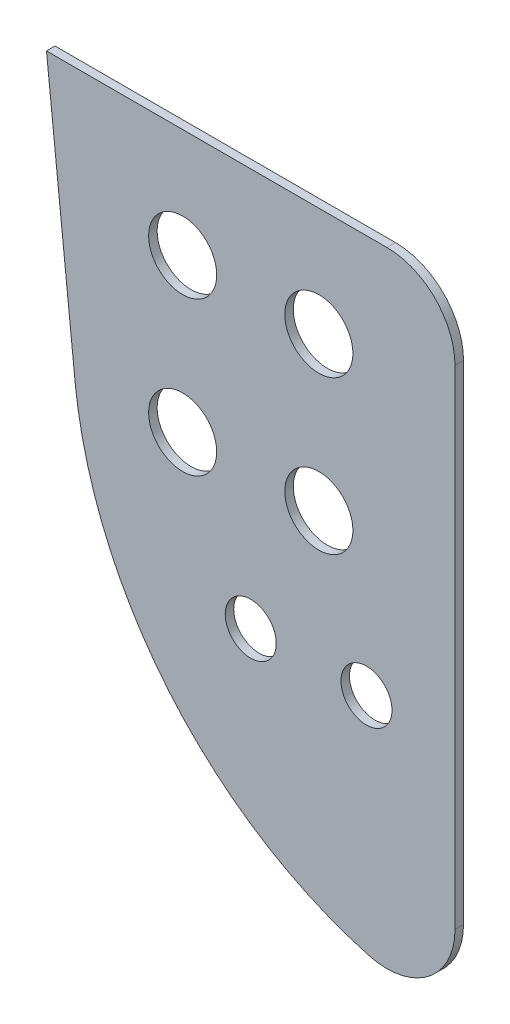
ISO-10303-21;
HEADER;
FILE_DESCRIPTION(('STEP AP214'),'2;1');
FILE_NAME('part.step','',(''),(''),'','','');
FILE_SCHEMA(('AUTOMOTIVE_DESIGN { 1 0 10303 214 1 1 1 1 }'));
ENDSEC;
DATA;
#1=APPLICATION_CONTEXT('core data for automotive mechanical design processes');
#2=APPLICATION_PROTOCOL_DEFINITION('international standard','automotive_design',2000,#1);
#3=PRODUCT_CONTEXT('',#1,'mechanical');
#4=PRODUCT('Part','Part','',(#3));
#5=PRODUCT_RELATED_PRODUCT_CATEGORY('part','',(#4));
#6=PRODUCT_DEFINITION_FORMATION('','',#4);
#7=PRODUCT_DEFINITION_CONTEXT('part definition',#1,'design');
#8=PRODUCT_DEFINITION('design','',#6,#7);
#9=PRODUCT_DEFINITION_SHAPE('','',#8);
#10=(LENGTH_UNIT() NAMED_UNIT(*) SI_UNIT(.MILLI.,.METRE.));
#11=(NAMED_UNIT(*) PLANE_ANGLE_UNIT() SI_UNIT($,.RADIAN.));
#12=(NAMED_UNIT(*) SI_UNIT($,.STERADIAN.) SOLID_ANGLE_UNIT());
#13=UNCERTAINTY_MEASURE_WITH_UNIT(LENGTH_MEASURE(1.E-05),#10,'distance_accuracy_value','');
#14=(GEOMETRIC_REPRESENTATION_CONTEXT(3) GLOBAL_UNCERTAINTY_ASSIGNED_CONTEXT((#13)) GLOBAL_UNIT_ASSIGNED_CONTEXT((#10,
#11,#12)) REPRESENTATION_CONTEXT('',''));
#15=CARTESIAN_POINT('',(0.,0.,0.));
#16=DIRECTION('',(0.,0.,1.));
#17=DIRECTION('',(1.,0.,0.));
#18=AXIS2_PLACEMENT_3D('',#15,#16,#17);
#19=CARTESIAN_POINT('',(-55.5753125764344,-162.067948142255,1.5875));
#20=CARTESIAN_POINT('',(-55.5937634202279,-162.065079619275,1.5875));
#21=CARTESIAN_POINT('',(-55.6501718933935,-162.056309884764,1.5875));
#22=CARTESIAN_POINT('',(-55.8583674100349,-162.023649385633,1.5875));
#23=CARTESIAN_POINT('',(-56.3514238039507,-161.944371510329,1.5875));
#24=CARTESIAN_POINT('',(-57.298183961833,-161.782953676702,1.5875));
#25=CARTESIAN_POINT('',(-59.6017022519586,-161.351219818293,1.5875));
#26=CARTESIAN_POINT('',(-62.636225687786,-160.651117849293,1.5875));
#27=CARTESIAN_POINT('',(-66.2582386472134,-159.610029405227,1.5875));
#28=CARTESIAN_POINT('',(-69.4663735532384,-158.528422887972,1.5875));
#29=CARTESIAN_POINT('',(-72.6936574974443,-157.269325681401,1.5875));
#30=CARTESIAN_POINT('',(-75.860283712135,-155.860035915543,1.5875));
#31=CARTESIAN_POINT('',(-78.9595045045267,-154.303585308623,1.5875));
#32=CARTESIAN_POINT('',(-81.984721099693,-152.603319471626,1.5875));
#33=CARTESIAN_POINT('',(-84.9294968822904,-150.762889624598,1.5875));
#34=CARTESIAN_POINT('',(-87.7875712408948,-148.786244312367,1.5875));
#35=CARTESIAN_POINT('',(-90.5528724272744,-146.677620257666,1.5875));
#36=CARTESIAN_POINT('',(-93.2195301655137,-144.441532811794,1.5875));
#37=CARTESIAN_POINT('',(-95.7818876467089,-142.082765830705,1.5875));
#38=CARTESIAN_POINT('',(-98.2345130698466,-139.606361101245,1.5875));
#39=CARTESIAN_POINT('',(-100.572210642775,-137.017607296888,1.5875));
#40=CARTESIAN_POINT('',(-102.790031074147,-134.322028508125,1.5875));
#41=CARTESIAN_POINT('',(-104.883281532582,-131.52537235786,1.5875));
#42=CARTESIAN_POINT('',(-106.847535073233,-128.633597726726,1.5875));
#43=CARTESIAN_POINT('',(-108.678639520184,-125.65286210404,1.5875));
#44=CARTESIAN_POINT('',(-110.372725796157,-122.589508584141,1.5875));
#45=CARTESIAN_POINT('',(-111.926215688639,-119.450052525176,1.5875));
#46=CARTESIAN_POINT('',(-113.335829040257,-116.241167889729,1.5875));
#47=CARTESIAN_POINT('',(-114.598590351131,-112.969673286444,1.5875));
#48=CARTESIAN_POINT('',(-115.711834779468,-109.64251773389,1.5875));
#49=CARTESIAN_POINT('',(-116.673213527241,-106.266766169047,1.5875));
#50=CARTESIAN_POINT('',(-117.480698597298,-102.849584724549,1.5875));
#51=CARTESIAN_POINT('',(-118.132586909511,-99.3982258005629,1.5875));
#52=CARTESIAN_POINT('',(-118.490033874139,-96.8861338876433,1.5875));
#53=CARTESIAN_POINT('',(-118.65560682663,-95.4515113050125,1.5875));
#54=CARTESIAN_POINT('',(-118.689766491121,-95.141139609897,1.5875));
#55=CARTESIAN_POINT('',(-118.706492882473,-94.9859144502731,1.5875));
#56=CARTESIAN_POINT('',(-118.715898663566,-94.8974127943878,1.5875));
#57=CARTESIAN_POINT('',(-118.721125626195,-94.8477178147802,1.5875));
#58=CARTESIAN_POINT('',(-118.722269765783,-94.8368399881106,1.5875));
#59=B_SPLINE_CURVE_WITH_KNOTS('',3,(#19,#20,#21,#22,#23,#24,#25,#26,#27,#28,#29,#30,#31,#32,#33,
#34,#35,#36,#37,#38,#39,#40,#41,#42,#43,#44,#45,#46,#47,#48,#49,#50,#51,#52,#53,#54,#55,#56,#57,
#58),.UNSPECIFIED.,.F.,.F.,(4,1,1,1,1,1,1,1,1,1,1,1,1,1,1,1,1,1,1,1,1,1,1,1,1,1,1,1,1,1,1,1,1,1,
1,1,1,4),(0.,0.000570633598854887,0.00174455815726286,0.00644023217890964,0.0158314421469477,
0.0310917362595948,0.0780426670362767,0.110904268378024,0.14610878501369,0.181308268021674,
0.216502218694187,0.251690199044534,0.286871835073815,0.322046819021149,0.357214910625814,
0.392375937451426,0.427529794346761,0.462676442118867,0.497815905524348,0.532948270670172,
0.568073681942947,0.603192338554142,0.638304490817737,0.673410436233072,0.708510515478586,
0.743605108360691,0.778694629810304,0.813779525947191,0.848860270265249,0.883937359958274,
0.919011312394996,0.954082661750745,0.989151955792768,0.994996677383629,0.997334554956801,
0.998503491454653,0.999672426456465,1.),.UNSPECIFIED.);
#60=DIRECTION('',(0.,0.,-1.));
#61=VECTOR('',#60,1.);
#62=SURFACE_OF_LINEAR_EXTRUSION('',#59,#61);
#63=CARTESIAN_POINT('',(-55.5753125764344,-162.067948142255,0.));
#64=CARTESIAN_POINT('',(-55.5937634202279,-162.065079619275,0.));
#65=CARTESIAN_POINT('',(-55.6501718933935,-162.056309884764,0.));
#66=CARTESIAN_POINT('',(-55.8583674100349,-162.023649385633,0.));
#67=CARTESIAN_POINT('',(-56.3514238039507,-161.944371510329,0.));
#68=CARTESIAN_POINT('',(-57.298183961833,-161.782953676702,0.));
#69=CARTESIAN_POINT('',(-59.6017022519586,-161.351219818293,0.));
#70=CARTESIAN_POINT('',(-62.636225687786,-160.651117849293,0.));
#71=CARTESIAN_POINT('',(-66.2582386472134,-159.610029405227,0.));
#72=CARTESIAN_POINT('',(-69.4663735532384,-158.528422887972,0.));
#73=CARTESIAN_POINT('',(-72.6936574974443,-157.269325681401,0.));
#74=CARTESIAN_POINT('',(-75.860283712135,-155.860035915543,0.));
#75=CARTESIAN_POINT('',(-78.9595045045267,-154.303585308623,0.));
#76=CARTESIAN_POINT('',(-81.984721099693,-152.603319471626,0.));
#77=CARTESIAN_POINT('',(-84.9294968822904,-150.762889624598,0.));
#78=CARTESIAN_POINT('',(-87.7875712408948,-148.786244312367,0.));
#79=CARTESIAN_POINT('',(-90.5528724272744,-146.677620257666,0.));
#80=CARTESIAN_POINT('',(-93.2195301655137,-144.441532811794,0.));
#81=CARTESIAN_POINT('',(-95.7818876467089,-142.082765830705,0.));
#82=CARTESIAN_POINT('',(-98.2345130698466,-139.606361101245,0.));
#83=CARTESIAN_POINT('',(-100.572210642775,-137.017607296888,0.));
#84=CARTESIAN_POINT('',(-102.790031074147,-134.322028508125,0.));
#85=CARTESIAN_POINT('',(-104.883281532582,-131.52537235786,0.));
#86=CARTESIAN_POINT('',(-106.847535073233,-128.633597726726,0.));
#87=CARTESIAN_POINT('',(-108.678639520184,-125.65286210404,0.));
#88=CARTESIAN_POINT('',(-110.372725796157,-122.589508584141,0.));
#89=CARTESIAN_POINT('',(-111.926215688639,-119.450052525176,0.));
#90=CARTESIAN_POINT('',(-113.335829040257,-116.241167889729,0.));
#91=CARTESIAN_POINT('',(-114.598590351131,-112.969673286444,0.));
#92=CARTESIAN_POINT('',(-115.711834779468,-109.64251773389,0.));
#93=CARTESIAN_POINT('',(-116.673213527241,-106.266766169047,0.));
#94=CARTESIAN_POINT('',(-117.480698597298,-102.849584724549,0.));
#95=CARTESIAN_POINT('',(-118.132586909511,-99.3982258005629,0.));
#96=CARTESIAN_POINT('',(-118.490033874139,-96.8861338876433,0.));
#97=CARTESIAN_POINT('',(-118.65560682663,-95.4515113050125,0.));
#98=CARTESIAN_POINT('',(-118.689766491121,-95.141139609897,0.));
#99=CARTESIAN_POINT('',(-118.706492882473,-94.9859144502731,0.));
#100=CARTESIAN_POINT('',(-118.715898663566,-94.8974127943878,0.));
#101=CARTESIAN_POINT('',(-118.721125626195,-94.8477178147802,0.));
#102=CARTESIAN_POINT('',(-118.722269765783,-94.8368399881106,0.));
#103=B_SPLINE_CURVE_WITH_KNOTS('',3,(#63,#64,#65,#66,#67,#68,#69,#70,#71,#72,#73,#74,#75,#76,
#77,#78,#79,#80,#81,#82,#83,#84,#85,#86,#87,#88,#89,#90,#91,#92,#93,#94,#95,#96,#97,#98,#99,
#100,#101,#102),.UNSPECIFIED.,.F.,.F.,(4,1,1,1,1,1,1,1,1,1,1,1,1,1,1,1,1,1,1,1,1,1,1,1,1,1,1,1,
1,1,1,1,1,1,1,1,1,4),(0.,0.000570633598854887,0.00174455815726286,0.00644023217890964,
0.0158314421469477,0.0310917362595948,0.0780426670362767,0.110904268378024,0.14610878501369,
0.181308268021674,0.216502218694187,0.251690199044534,0.286871835073815,0.322046819021149,
0.357214910625814,0.392375937451426,0.427529794346761,0.462676442118867,0.497815905524348,
0.532948270670172,0.568073681942947,0.603192338554142,0.638304490817737,0.673410436233072,
0.708510515478586,0.743605108360691,0.778694629810304,0.813779525947191,0.848860270265249,
0.883937359958274,0.919011312394996,0.954082661750745,0.989151955792768,0.994996677383629,
0.997334554956801,0.998503491454653,0.999672426456465,1.),.UNSPECIFIED.);
#104=CARTESIAN_POINT('',(-63.9271253798359,-160.270180817145,0.));
#105=VERTEX_POINT('',#104);
#106=CARTESIAN_POINT('',(-118.722269765783,-94.8368399881106,0.));
#107=VERTEX_POINT('',#106);
#108=EDGE_CURVE('E121',#105,#107,#103,.T.);
#109=ORIENTED_EDGE('',*,*,#108,.F.);
#110=DIRECTION('',(0.,0.,-1.));
#111=VECTOR('',#110,1.);
#112=CARTESIAN_POINT('',(-63.9271253798359,-160.270180817145,0.));
#113=LINE('',#112,#111);
#114=CARTESIAN_POINT('',(-63.9271253798359,-160.270180817145,1.5875));
#115=VERTEX_POINT('',#114);
#116=EDGE_CURVE('E63',#105,#115,#113,.F.);
#117=ORIENTED_EDGE('',*,*,#116,.T.);
#118=CARTESIAN_POINT('',(-118.722269765783,-94.8368399881106,1.5875));
#119=VERTEX_POINT('',#118);
#120=EDGE_CURVE('E134',#115,#119,#59,.T.);
#121=ORIENTED_EDGE('',*,*,#120,.T.);
#122=DIRECTION('',(0.,0.,-1.));
#123=VECTOR('',#122,1.);
#124=CARTESIAN_POINT('',(-118.722269765783,-94.8368399881106,1.5875));
#125=LINE('',#124,#123);
#126=EDGE_CURVE('E106',#119,#107,#125,.T.);
#127=ORIENTED_EDGE('',*,*,#126,.T.);
#128=EDGE_LOOP('',(#109,#117,#121,#127));
#129=FACE_BOUND('',#128,.T.);
#130=ADVANCED_FACE('F40',(#129),#62,.T.);
#131=CARTESIAN_POINT('',(-47.8397885828951,0.,1.5875));
#132=DIRECTION('',(-1.,0.,0.));
#133=DIRECTION('',(0.,-1.,0.));
#134=AXIS2_PLACEMENT_3D('',#131,#132,#133);
#135=PLANE('',#134);
#136=DIRECTION('',(0.,1.,0.));
#137=VECTOR('',#136,1.);
#138=CARTESIAN_POINT('',(-47.8397885828951,0.,1.5875));
#139=LINE('',#138,#137);
#140=CARTESIAN_POINT('',(-47.8397885828951,-148.030248242818,1.5875));
#141=VERTEX_POINT('',#140);
#142=CARTESIAN_POINT('',(-47.8397885828951,-56.9164496537827,1.5875));
#143=VERTEX_POINT('',#142);
#144=EDGE_CURVE('E111',#141,#143,#139,.T.);
#145=ORIENTED_EDGE('',*,*,#144,.F.);
#146=DIRECTION('',(0.,0.,1.));
#147=VECTOR('',#146,1.);
#148=CARTESIAN_POINT('',(-47.8397885828951,-148.030248242818,0.));
#149=LINE('',#148,#147);
#150=CARTESIAN_POINT('',(-47.8397885828951,-148.030248242818,0.));
#151=VERTEX_POINT('',#150);
#152=EDGE_CURVE('E137',#141,#151,#149,.F.);
#153=ORIENTED_EDGE('',*,*,#152,.T.);
#154=DIRECTION('',(0.,1.,0.));
#155=VECTOR('',#154,1.);
#156=CARTESIAN_POINT('',(-47.8397885828951,0.,0.));
#157=LINE('',#156,#155);
#158=CARTESIAN_POINT('',(-47.8397885828951,-56.9164496537827,0.));
#159=VERTEX_POINT('',#158);
#160=EDGE_CURVE('E125',#151,#159,#157,.T.);
#161=ORIENTED_EDGE('',*,*,#160,.T.);
#162=DIRECTION('',(0.,0.,-1.));
#163=VECTOR('',#162,1.);
#164=CARTESIAN_POINT('',(-47.8397885828951,-56.9164496537827,1.5875));
#165=LINE('',#164,#163);
#166=EDGE_CURVE('E105',#159,#143,#165,.F.);
#167=ORIENTED_EDGE('',*,*,#166,.T.);
#168=EDGE_LOOP('',(#145,#153,#161,#167));
#169=FACE_BOUND('',#168,.T.);
#170=ADVANCED_FACE('F231',(#169),#135,.F.);
#171=CARTESIAN_POINT('',(0.,-44.2164496537827,1.5875));
#172=DIRECTION('',(0.,1.,0.));
#173=DIRECTION('',(-1.,0.,0.));
#174=AXIS2_PLACEMENT_3D('',#171,#172,#173);
#175=PLANE('',#174);
#176=DIRECTION('',(1.,0.,0.));
#177=VECTOR('',#176,1.);
#178=CARTESIAN_POINT('',(0.,-44.2164496537827,1.5875));
#179=LINE('',#178,#177);
#180=CARTESIAN_POINT('',(-124.039788582895,-44.2164496537827,1.5875));
#181=VERTEX_POINT('',#180);
#182=CARTESIAN_POINT('',(-60.5397885828951,-44.2164496537827,1.5875));
#183=VERTEX_POINT('',#182);
#184=EDGE_CURVE('E97',#181,#183,#179,.T.);
#185=ORIENTED_EDGE('',*,*,#184,.T.);
#186=DIRECTION('',(0.,0.,-1.));
#187=VECTOR('',#186,1.);
#188=CARTESIAN_POINT('',(-60.5397885828951,-44.2164496537827,0.));
#189=LINE('',#188,#187);
#190=CARTESIAN_POINT('',(-60.5397885828951,-44.2164496537827,0.));
#191=VERTEX_POINT('',#190);
#192=EDGE_CURVE('E12',#183,#191,#189,.T.);
#193=ORIENTED_EDGE('',*,*,#192,.T.);
#194=DIRECTION('',(1.,0.,0.));
#195=VECTOR('',#194,1.);
#196=CARTESIAN_POINT('',(0.,-44.2164496537827,0.));
#197=LINE('',#196,#195);
#198=CARTESIAN_POINT('',(-124.039788582895,-44.2164496537827,0.));
#199=VERTEX_POINT('',#198);
#200=EDGE_CURVE('E100',#199,#191,#197,.T.);
#201=ORIENTED_EDGE('',*,*,#200,.F.);
#202=DIRECTION('',(0.,0.,-1.));
#203=VECTOR('',#202,1.);
#204=CARTESIAN_POINT('',(-124.039788582895,-44.2164496537827,1.5875));
#205=LINE('',#204,#203);
#206=EDGE_CURVE('E95',#181,#199,#205,.T.);
#207=ORIENTED_EDGE('',*,*,#206,.F.);
#208=EDGE_LOOP('',(#185,#193,#201,#207));
#209=FACE_BOUND('',#208,.T.);
#210=ADVANCED_FACE('F96',(#209),#175,.T.);
#211=CARTESIAN_POINT('',(-127.280074158691,-13.3703866151999,1.5875));
#212=DIRECTION('',(-0.994527813863391,-0.104472137204636,0.));
#213=DIRECTION('',(0.104472137204636,-0.994527813863391,0.));
#214=AXIS2_PLACEMENT_3D('',#211,#212,#213);
#215=PLANE('',#214);
#216=DIRECTION('',(-0.104472137204636,0.994527813863391,0.));
#217=VECTOR('',#216,1.);
#218=CARTESIAN_POINT('',(-127.280074158691,-13.3703866151999,0.));
#219=LINE('',#218,#217);
#220=EDGE_CURVE('E133',#107,#199,#219,.T.);
#221=ORIENTED_EDGE('',*,*,#220,.F.);
#222=ORIENTED_EDGE('',*,*,#126,.F.);
#223=DIRECTION('',(-0.104472137204636,0.994527813863391,0.));
#224=VECTOR('',#223,1.);
#225=CARTESIAN_POINT('',(-127.280074158691,-13.3703866151999,1.5875));
#226=LINE('',#225,#224);
#227=EDGE_CURVE('E110',#119,#181,#226,.T.);
#228=ORIENTED_EDGE('',*,*,#227,.T.);
#229=ORIENTED_EDGE('',*,*,#206,.T.);
#230=EDGE_LOOP('',(#221,#222,#228,#229));
#231=FACE_BOUND('',#230,.T.);
#232=ADVANCED_FACE('F114',(#231),#215,.T.);
#233=CARTESIAN_POINT('',(0.,0.,1.5875));
#234=DIRECTION('',(0.,0.,1.));
#235=DIRECTION('',(1.,0.,0.));
#236=AXIS2_PLACEMENT_3D('',#233,#234,#235);
#237=PLANE('',#236);
#238=CARTESIAN_POINT('',(-85.9397885828951,-118.511449653783,1.5875));
#239=DIRECTION('',(0.,0.,-1.));
#240=DIRECTION('',(-1.,0.,0.));
#241=AXIS2_PLACEMENT_3D('',#238,#239,#240);
#242=CIRCLE('',#241,4.7625);
#243=CARTESIAN_POINT('',(-90.7022885828951,-118.511449653783,1.5875));
#244=VERTEX_POINT('',#243);
#245=EDGE_CURVE('E199',#244,#244,#242,.T.);
#246=ORIENTED_EDGE('',*,*,#245,.T.);
#247=EDGE_LOOP('',(#246));
#248=FACE_BOUND('',#247,.T.);
#249=CARTESIAN_POINT('',(-73.2397885828951,-93.1114496537827,1.5875));
#250=DIRECTION('',(0.,0.,-1.));
#251=DIRECTION('',(-1.,0.,0.));
#252=AXIS2_PLACEMENT_3D('',#249,#250,#251);
#253=CIRCLE('',#252,6.34999999999999);
#254=CARTESIAN_POINT('',(-79.5897885828951,-93.1114496537827,1.5875));
#255=VERTEX_POINT('',#254);
#256=EDGE_CURVE('E192',#255,#255,#253,.T.);
#257=ORIENTED_EDGE('',*,*,#256,.T.);
#258=EDGE_LOOP('',(#257));
#259=FACE_BOUND('',#258,.T.);
#260=CARTESIAN_POINT('',(-98.6397885828951,-93.1114496537827,1.5875));
#261=DIRECTION('',(0.,0.,-1.));
#262=DIRECTION('',(-1.,0.,0.));
#263=AXIS2_PLACEMENT_3D('',#260,#261,#262);
#264=CIRCLE('',#263,6.34999999999999);
#265=CARTESIAN_POINT('',(-104.989788582895,-93.1114496537827,1.5875));
#266=VERTEX_POINT('',#265);
#267=EDGE_CURVE('E186',#266,#266,#264,.T.);
#268=ORIENTED_EDGE('',*,*,#267,.T.);
#269=EDGE_LOOP('',(#268));
#270=FACE_BOUND('',#269,.T.);
#271=CARTESIAN_POINT('',(-98.6397885828951,-64.5364496537827,1.5875));
#272=DIRECTION('',(0.,0.,-1.));
#273=DIRECTION('',(-1.,0.,0.));
#274=AXIS2_PLACEMENT_3D('',#271,#272,#273);
#275=CIRCLE('',#274,6.34999999999999);
#276=CARTESIAN_POINT('',(-104.989788582895,-64.5364496537827,1.5875));
#277=VERTEX_POINT('',#276);
#278=EDGE_CURVE('E175',#277,#277,#275,.T.);
#279=ORIENTED_EDGE('',*,*,#278,.T.);
#280=EDGE_LOOP('',(#279));
#281=FACE_BOUND('',#280,.T.);
#282=CARTESIAN_POINT('',(-73.2397885828951,-64.5364496537827,1.5875));
#283=DIRECTION('',(0.,0.,-1.));
#284=DIRECTION('',(-1.,0.,0.));
#285=AXIS2_PLACEMENT_3D('',#282,#283,#284);
#286=CIRCLE('',#285,6.34999999999999);
#287=CARTESIAN_POINT('',(-79.5897885828951,-64.5364496537827,1.5875));
#288=VERTEX_POINT('',#287);
#289=EDGE_CURVE('E176',#288,#288,#286,.T.);
#290=ORIENTED_EDGE('',*,*,#289,.T.);
#291=EDGE_LOOP('',(#290));
#292=FACE_BOUND('',#291,.T.);
#293=CARTESIAN_POINT('',(-64.3497885828951,-118.511449653783,1.5875));
#294=DIRECTION('',(0.,0.,-1.));
#295=DIRECTION('',(-1.,0.,0.));
#296=AXIS2_PLACEMENT_3D('',#293,#294,#295);
#297=CIRCLE('',#296,4.7625);
#298=CARTESIAN_POINT('',(-69.1122885828951,-118.511449653783,1.5875));
#299=VERTEX_POINT('',#298);
#300=EDGE_CURVE('E126',#299,#299,#297,.T.);
#301=ORIENTED_EDGE('',*,*,#300,.T.);
#302=EDGE_LOOP('',(#301));
#303=FACE_BOUND('',#302,.T.);
#304=ORIENTED_EDGE('',*,*,#120,.F.);
#305=CARTESIAN_POINT('',(-60.5397885828941,-148.030248242818,1.5875));
#306=DIRECTION('',(0.,0.,1.));
#307=DIRECTION('',(1.,0.,0.));
#308=AXIS2_PLACEMENT_3D('',#305,#306,#307);
#309=CIRCLE('',#308,12.7);
#310=EDGE_CURVE('E48',#115,#141,#309,.T.);
#311=ORIENTED_EDGE('',*,*,#310,.T.);
#312=ORIENTED_EDGE('',*,*,#144,.T.);
#313=CARTESIAN_POINT('',(-60.5397885828951,-56.9164496537827,1.5875));
#314=DIRECTION('',(0.,0.,1.));
#315=DIRECTION('',(1.,0.,0.));
#316=AXIS2_PLACEMENT_3D('',#313,#314,#315);
#317=CIRCLE('',#316,12.7);
#318=EDGE_CURVE('E55',#143,#183,#317,.T.);
#319=ORIENTED_EDGE('',*,*,#318,.T.);
#320=ORIENTED_EDGE('',*,*,#184,.F.);
#321=ORIENTED_EDGE('',*,*,#227,.F.);
#322=EDGE_LOOP('',(#304,#311,#312,#319,#320,#321));
#323=FACE_BOUND('',#322,.T.);
#324=ADVANCED_FACE('F109',(#248,#259,#270,#281,#292,#303,#323),#237,.T.);
#325=CARTESIAN_POINT('',(0.,0.,0.));
#326=DIRECTION('',(0.,0.,1.));
#327=DIRECTION('',(1.,0.,0.));
#328=AXIS2_PLACEMENT_3D('',#325,#326,#327);
#329=PLANE('',#328);
#330=CARTESIAN_POINT('',(-85.9397885828951,-118.511449653783,0.));
#331=DIRECTION('',(0.,0.,-1.));
#332=DIRECTION('',(-1.,0.,0.));
#333=AXIS2_PLACEMENT_3D('',#330,#331,#332);
#334=CIRCLE('',#333,4.7625);
#335=CARTESIAN_POINT('',(-90.7022885828951,-118.511449653783,0.));
#336=VERTEX_POINT('',#335);
#337=EDGE_CURVE('E196',#336,#336,#334,.T.);
#338=ORIENTED_EDGE('',*,*,#337,.F.);
#339=EDGE_LOOP('',(#338));
#340=FACE_BOUND('',#339,.T.);
#341=CARTESIAN_POINT('',(-73.2397885828951,-93.1114496537827,0.));
#342=DIRECTION('',(0.,0.,-1.));
#343=DIRECTION('',(-1.,0.,0.));
#344=AXIS2_PLACEMENT_3D('',#341,#342,#343);
#345=CIRCLE('',#344,6.34999999999999);
#346=CARTESIAN_POINT('',(-79.5897885828951,-93.1114496537827,0.));
#347=VERTEX_POINT('',#346);
#348=EDGE_CURVE('E190',#347,#347,#345,.T.);
#349=ORIENTED_EDGE('',*,*,#348,.F.);
#350=EDGE_LOOP('',(#349));
#351=FACE_BOUND('',#350,.T.);
#352=CARTESIAN_POINT('',(-98.6397885828951,-93.1114496537827,0.));
#353=DIRECTION('',(0.,0.,-1.));
#354=DIRECTION('',(-1.,0.,0.));
#355=AXIS2_PLACEMENT_3D('',#352,#353,#354);
#356=CIRCLE('',#355,6.34999999999999);
#357=CARTESIAN_POINT('',(-104.989788582895,-93.1114496537827,0.));
#358=VERTEX_POINT('',#357);
#359=EDGE_CURVE('E180',#358,#358,#356,.T.);
#360=ORIENTED_EDGE('',*,*,#359,.F.);
#361=EDGE_LOOP('',(#360));
#362=FACE_BOUND('',#361,.T.);
#363=CARTESIAN_POINT('',(-98.6397885828951,-64.5364496537827,0.));
#364=DIRECTION('',(0.,0.,-1.));
#365=DIRECTION('',(-1.,0.,0.));
#366=AXIS2_PLACEMENT_3D('',#363,#364,#365);
#367=CIRCLE('',#366,6.34999999999999);
#368=CARTESIAN_POINT('',(-104.989788582895,-64.5364496537827,0.));
#369=VERTEX_POINT('',#368);
#370=EDGE_CURVE('E172',#369,#369,#367,.T.);
#371=ORIENTED_EDGE('',*,*,#370,.F.);
#372=EDGE_LOOP('',(#371));
#373=FACE_BOUND('',#372,.T.);
#374=CARTESIAN_POINT('',(-73.2397885828951,-64.5364496537827,0.));
#375=DIRECTION('',(0.,0.,-1.));
#376=DIRECTION('',(-1.,0.,0.));
#377=AXIS2_PLACEMENT_3D('',#374,#375,#376);
#378=CIRCLE('',#377,6.34999999999999);
#379=CARTESIAN_POINT('',(-79.5897885828951,-64.5364496537827,0.));
#380=VERTEX_POINT('',#379);
#381=EDGE_CURVE('E203',#380,#380,#378,.T.);
#382=ORIENTED_EDGE('',*,*,#381,.F.);
#383=EDGE_LOOP('',(#382));
#384=FACE_BOUND('',#383,.T.);
#385=CARTESIAN_POINT('',(-64.3497885828951,-118.511449653783,0.));
#386=DIRECTION('',(0.,0.,-1.));
#387=DIRECTION('',(-1.,0.,0.));
#388=AXIS2_PLACEMENT_3D('',#385,#386,#387);
#389=CIRCLE('',#388,4.7625);
#390=CARTESIAN_POINT('',(-69.1122885828951,-118.511449653783,0.));
#391=VERTEX_POINT('',#390);
#392=EDGE_CURVE('E157',#391,#391,#389,.T.);
#393=ORIENTED_EDGE('',*,*,#392,.F.);
#394=EDGE_LOOP('',(#393));
#395=FACE_BOUND('',#394,.T.);
#396=ORIENTED_EDGE('',*,*,#160,.F.);
#397=CARTESIAN_POINT('',(-60.5397885828941,-148.030248242818,0.));
#398=DIRECTION('',(0.,0.,1.));
#399=DIRECTION('',(1.,0.,0.));
#400=AXIS2_PLACEMENT_3D('',#397,#398,#399);
#401=CIRCLE('',#400,12.7);
#402=EDGE_CURVE('E142',#151,#105,#401,.F.);
#403=ORIENTED_EDGE('',*,*,#402,.T.);
#404=ORIENTED_EDGE('',*,*,#108,.T.);
#405=ORIENTED_EDGE('',*,*,#220,.T.);
#406=ORIENTED_EDGE('',*,*,#200,.T.);
#407=CARTESIAN_POINT('',(-60.5397885828951,-56.9164496537827,0.));
#408=DIRECTION('',(0.,0.,1.));
#409=DIRECTION('',(1.,0.,0.));
#410=AXIS2_PLACEMENT_3D('',#407,#408,#409);
#411=CIRCLE('',#410,12.7);
#412=EDGE_CURVE('E140',#191,#159,#411,.F.);
#413=ORIENTED_EDGE('',*,*,#412,.T.);
#414=EDGE_LOOP('',(#396,#403,#404,#405,#406,#413));
#415=FACE_BOUND('',#414,.T.);
#416=ADVANCED_FACE('F219',(#340,#351,#362,#373,#384,#395,#415),#329,.F.);
#417=CARTESIAN_POINT('',(-64.3497885828951,-118.511449653783,1.5875));
#418=DIRECTION('',(0.,0.,-1.));
#419=DIRECTION('',(-1.,0.,0.));
#420=AXIS2_PLACEMENT_3D('',#417,#418,#419);
#421=CYLINDRICAL_SURFACE('',#420,4.7625);
#422=ORIENTED_EDGE('',*,*,#300,.F.);
#423=EDGE_LOOP('',(#422));
#424=FACE_BOUND('',#423,.T.);
#425=ORIENTED_EDGE('',*,*,#392,.T.);
#426=EDGE_LOOP('',(#425));
#427=FACE_BOUND('',#426,.T.);
#428=ADVANCED_FACE('F215',(#424,#427),#421,.F.);
#429=CARTESIAN_POINT('',(-73.2397885828951,-64.5364496537827,1.5875));
#430=DIRECTION('',(0.,0.,-1.));
#431=DIRECTION('',(-1.,0.,0.));
#432=AXIS2_PLACEMENT_3D('',#429,#430,#431);
#433=CYLINDRICAL_SURFACE('',#432,6.34999999999999);
#434=ORIENTED_EDGE('',*,*,#289,.F.);
#435=EDGE_LOOP('',(#434));
#436=FACE_BOUND('',#435,.T.);
#437=ORIENTED_EDGE('',*,*,#381,.T.);
#438=EDGE_LOOP('',(#437));
#439=FACE_BOUND('',#438,.T.);
#440=ADVANCED_FACE('F211',(#436,#439),#433,.F.);
#441=CARTESIAN_POINT('',(-98.6397885828951,-64.5364496537827,1.5875));
#442=DIRECTION('',(0.,0.,-1.));
#443=DIRECTION('',(-1.,0.,0.));
#444=AXIS2_PLACEMENT_3D('',#441,#442,#443);
#445=CYLINDRICAL_SURFACE('',#444,6.34999999999999);
#446=ORIENTED_EDGE('',*,*,#278,.F.);
#447=EDGE_LOOP('',(#446));
#448=FACE_BOUND('',#447,.T.);
#449=ORIENTED_EDGE('',*,*,#370,.T.);
#450=EDGE_LOOP('',(#449));
#451=FACE_BOUND('',#450,.T.);
#452=ADVANCED_FACE('F214',(#448,#451),#445,.F.);
#453=CARTESIAN_POINT('',(-98.6397885828951,-93.1114496537827,1.5875));
#454=DIRECTION('',(0.,0.,-1.));
#455=DIRECTION('',(-1.,0.,0.));
#456=AXIS2_PLACEMENT_3D('',#453,#454,#455);
#457=CYLINDRICAL_SURFACE('',#456,6.34999999999999);
#458=ORIENTED_EDGE('',*,*,#267,.F.);
#459=EDGE_LOOP('',(#458));
#460=FACE_BOUND('',#459,.T.);
#461=ORIENTED_EDGE('',*,*,#359,.T.);
#462=EDGE_LOOP('',(#461));
#463=FACE_BOUND('',#462,.T.);
#464=ADVANCED_FACE('F265',(#460,#463),#457,.F.);
#465=CARTESIAN_POINT('',(-73.2397885828951,-93.1114496537827,1.5875));
#466=DIRECTION('',(0.,0.,-1.));
#467=DIRECTION('',(-1.,0.,0.));
#468=AXIS2_PLACEMENT_3D('',#465,#466,#467);
#469=CYLINDRICAL_SURFACE('',#468,6.34999999999999);
#470=ORIENTED_EDGE('',*,*,#256,.F.);
#471=EDGE_LOOP('',(#470));
#472=FACE_BOUND('',#471,.T.);
#473=ORIENTED_EDGE('',*,*,#348,.T.);
#474=EDGE_LOOP('',(#473));
#475=FACE_BOUND('',#474,.T.);
#476=ADVANCED_FACE('F243',(#472,#475),#469,.F.);
#477=CARTESIAN_POINT('',(-85.9397885828951,-118.511449653783,1.5875));
#478=DIRECTION('',(0.,0.,-1.));
#479=DIRECTION('',(-1.,0.,0.));
#480=AXIS2_PLACEMENT_3D('',#477,#478,#479);
#481=CYLINDRICAL_SURFACE('',#480,4.7625);
#482=ORIENTED_EDGE('',*,*,#245,.F.);
#483=EDGE_LOOP('',(#482));
#484=FACE_BOUND('',#483,.T.);
#485=ORIENTED_EDGE('',*,*,#337,.T.);
#486=EDGE_LOOP('',(#485));
#487=FACE_BOUND('',#486,.T.);
#488=ADVANCED_FACE('F238',(#484,#487),#481,.F.);
#489=CARTESIAN_POINT('',(-60.5397885828941,-148.030248242818,0.79375));
#490=DIRECTION('',(0.,0.,-1.));
#491=DIRECTION('',(-1.,0.,0.));
#492=AXIS2_PLACEMENT_3D('',#489,#490,#491);
#493=CYLINDRICAL_SURFACE('',#492,12.7);
#494=ORIENTED_EDGE('',*,*,#310,.F.);
#495=ORIENTED_EDGE('',*,*,#116,.F.);
#496=ORIENTED_EDGE('',*,*,#402,.F.);
#497=ORIENTED_EDGE('',*,*,#152,.F.);
#498=EDGE_LOOP('',(#494,#495,#496,#497));
#499=FACE_BOUND('',#498,.T.);
#500=ADVANCED_FACE('F236',(#499),#493,.T.);
#501=CARTESIAN_POINT('',(-60.5397885828951,-56.9164496537827,1.5875));
#502=DIRECTION('',(0.,0.,1.));
#503=DIRECTION('',(1.,0.,0.));
#504=AXIS2_PLACEMENT_3D('',#501,#502,#503);
#505=CYLINDRICAL_SURFACE('',#504,12.7);
#506=ORIENTED_EDGE('',*,*,#318,.F.);
#507=ORIENTED_EDGE('',*,*,#166,.F.);
#508=ORIENTED_EDGE('',*,*,#412,.F.);
#509=ORIENTED_EDGE('',*,*,#192,.F.);
#510=EDGE_LOOP('',(#506,#507,#508,#509));
#511=FACE_BOUND('',#510,.T.);
#512=ADVANCED_FACE('F42',(#511),#505,.T.);
#513=CLOSED_SHELL('',(#130,#170,#210,#232,#324,#416,#428,#440,#452,#464,#476,#488,#500,#512));
#514=MANIFOLD_SOLID_BREP('B2',#513);
#515=ADVANCED_BREP_SHAPE_REPRESENTATION('',(#18,#514),#14);
#516=SHAPE_DEFINITION_REPRESENTATION(#9,#515);
ENDSEC;
END-ISO-10303-21;
